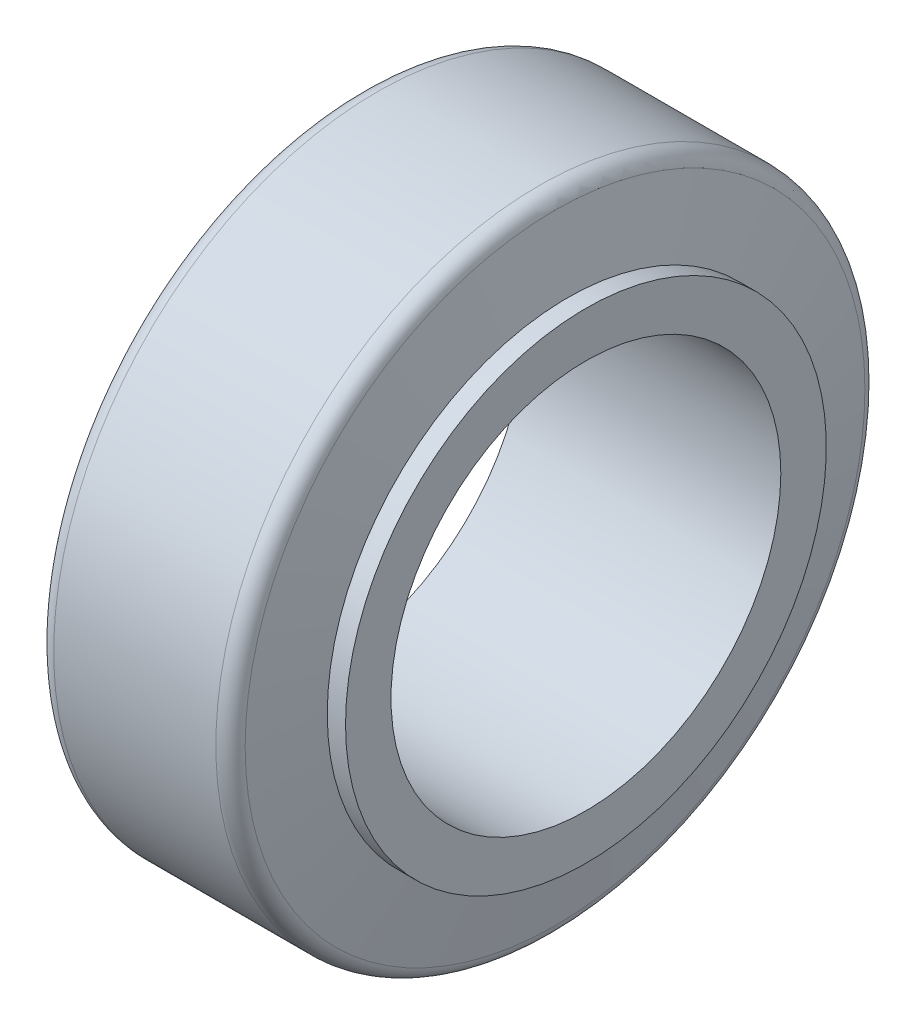
ISO-10303-21;
HEADER;
FILE_DESCRIPTION(('STEP AP214'),'2;1');
FILE_NAME('part.step','',(''),(''),'','','');
FILE_SCHEMA(('AUTOMOTIVE_DESIGN { 1 0 10303 214 1 1 1 1 }'));
ENDSEC;
DATA;
#1=APPLICATION_CONTEXT('core data for automotive mechanical design processes');
#2=APPLICATION_PROTOCOL_DEFINITION('international standard','automotive_design',2000,#1);
#3=PRODUCT_CONTEXT('',#1,'mechanical');
#4=PRODUCT('Part','Part','',(#3));
#5=PRODUCT_RELATED_PRODUCT_CATEGORY('part','',(#4));
#6=PRODUCT_DEFINITION_FORMATION('','',#4);
#7=PRODUCT_DEFINITION_CONTEXT('part definition',#1,'design');
#8=PRODUCT_DEFINITION('design','',#6,#7);
#9=PRODUCT_DEFINITION_SHAPE('','',#8);
#10=(LENGTH_UNIT() NAMED_UNIT(*) SI_UNIT(.MILLI.,.METRE.));
#11=(NAMED_UNIT(*) PLANE_ANGLE_UNIT() SI_UNIT($,.RADIAN.));
#12=(NAMED_UNIT(*) SI_UNIT($,.STERADIAN.) SOLID_ANGLE_UNIT());
#13=UNCERTAINTY_MEASURE_WITH_UNIT(LENGTH_MEASURE(1.E-05),#10,'distance_accuracy_value','');
#14=(GEOMETRIC_REPRESENTATION_CONTEXT(3) GLOBAL_UNCERTAINTY_ASSIGNED_CONTEXT((#13)) GLOBAL_UNIT_ASSIGNED_CONTEXT((#10,
#11,#12)) REPRESENTATION_CONTEXT('',''));
#15=CARTESIAN_POINT('',(0.,0.,0.));
#16=DIRECTION('',(0.,0.,1.));
#17=DIRECTION('',(1.,0.,0.));
#18=AXIS2_PLACEMENT_3D('',#15,#16,#17);
#19=CARTESIAN_POINT('',(11.65,0.,0.));
#20=DIRECTION('',(-1.,0.,0.));
#21=DIRECTION('',(0.,0.,1.));
#22=AXIS2_PLACEMENT_3D('',#19,#20,#21);
#23=CONICAL_SURFACE('',#22,39.8,1.39137423336047);
#24=CARTESIAN_POINT('',(11.9480092545903,0.,0.));
#25=DIRECTION('',(1.,0.,0.));
#26=DIRECTION('',(0.,0.,-1.));
#27=AXIS2_PLACEMENT_3D('',#24,#25,#26);
#28=CIRCLE('',#27,38.1569219476642);
#29=CARTESIAN_POINT('',(11.9480092545903,0.,-38.1569219476642));
#30=VERTEX_POINT('',#29);
#31=EDGE_CURVE('E10',#30,#30,#28,.T.);
#32=ORIENTED_EDGE('',*,*,#31,.T.);
#33=EDGE_LOOP('',(#32));
#34=FACE_BOUND('',#33,.T.);
#35=CARTESIAN_POINT('',(13.5,0.,0.));
#36=DIRECTION('',(-1.,0.,0.));
#37=DIRECTION('',(0.,0.,1.));
#38=AXIS2_PLACEMENT_3D('',#35,#36,#37);
#39=CIRCLE('',#38,29.6);
#40=CARTESIAN_POINT('',(13.5,0.,29.6));
#41=VERTEX_POINT('',#40);
#42=EDGE_CURVE('E58',#41,#41,#39,.T.);
#43=ORIENTED_EDGE('',*,*,#42,.T.);
#44=EDGE_LOOP('',(#43));
#45=FACE_BOUND('',#44,.T.);
#46=ADVANCED_FACE('F38',(#34,#45),#23,.T.);
#47=CARTESIAN_POINT('',(0.,0.,0.));
#48=DIRECTION('',(-1.,0.,0.));
#49=DIRECTION('',(0.,0.,1.));
#50=AXIS2_PLACEMENT_3D('',#47,#48,#49);
#51=CYLINDRICAL_SURFACE('',#50,29.6);
#52=CARTESIAN_POINT('',(15.75,0.,0.));
#53=DIRECTION('',(-1.,0.,0.));
#54=DIRECTION('',(0.,0.,1.));
#55=AXIS2_PLACEMENT_3D('',#52,#53,#54);
#56=CIRCLE('',#55,29.6);
#57=CARTESIAN_POINT('',(15.75,0.,29.6));
#58=VERTEX_POINT('',#57);
#59=EDGE_CURVE('E61',#58,#58,#56,.T.);
#60=ORIENTED_EDGE('',*,*,#59,.T.);
#61=EDGE_LOOP('',(#60));
#62=FACE_BOUND('',#61,.T.);
#63=ORIENTED_EDGE('',*,*,#42,.F.);
#64=EDGE_LOOP('',(#63));
#65=FACE_BOUND('',#64,.T.);
#66=ADVANCED_FACE('F98',(#62,#65),#51,.T.);
#67=CARTESIAN_POINT('',(15.75,-29.6,0.));
#68=DIRECTION('',(1.,0.,0.));
#69=DIRECTION('',(0.,0.,-1.));
#70=AXIS2_PLACEMENT_3D('',#67,#68,#69);
#71=PLANE('',#70);
#72=CARTESIAN_POINT('',(15.75,0.,0.));
#73=DIRECTION('',(1.,0.,0.));
#74=DIRECTION('',(0.,0.,-1.));
#75=AXIS2_PLACEMENT_3D('',#72,#73,#74);
#76=CIRCLE('',#75,24.);
#77=CARTESIAN_POINT('',(15.75,0.,-24.));
#78=VERTEX_POINT('',#77);
#79=EDGE_CURVE('E70',#78,#78,#76,.T.);
#80=ORIENTED_EDGE('',*,*,#79,.F.);
#81=EDGE_LOOP('',(#80));
#82=FACE_BOUND('',#81,.T.);
#83=ORIENTED_EDGE('',*,*,#59,.F.);
#84=EDGE_LOOP('',(#83));
#85=FACE_BOUND('',#84,.T.);
#86=ADVANCED_FACE('F83',(#82,#85),#71,.T.);
#87=CARTESIAN_POINT('',(-15.75,-29.6,0.));
#88=DIRECTION('',(-1.,0.,0.));
#89=DIRECTION('',(0.,0.,1.));
#90=AXIS2_PLACEMENT_3D('',#87,#88,#89);
#91=PLANE('',#90);
#92=CARTESIAN_POINT('',(-15.75,0.,0.));
#93=DIRECTION('',(-1.,0.,0.));
#94=DIRECTION('',(0.,0.,1.));
#95=AXIS2_PLACEMENT_3D('',#92,#93,#94);
#96=CIRCLE('',#95,24.);
#97=CARTESIAN_POINT('',(-15.75,0.,24.));
#98=VERTEX_POINT('',#97);
#99=EDGE_CURVE('E42',#98,#98,#96,.T.);
#100=ORIENTED_EDGE('',*,*,#99,.F.);
#101=EDGE_LOOP('',(#100));
#102=FACE_BOUND('',#101,.T.);
#103=CARTESIAN_POINT('',(-15.75,0.,0.));
#104=DIRECTION('',(-1.,0.,0.));
#105=DIRECTION('',(0.,0.,1.));
#106=AXIS2_PLACEMENT_3D('',#103,#104,#105);
#107=CIRCLE('',#106,29.6);
#108=CARTESIAN_POINT('',(-15.75,0.,29.6));
#109=VERTEX_POINT('',#108);
#110=EDGE_CURVE('E64',#109,#109,#107,.T.);
#111=ORIENTED_EDGE('',*,*,#110,.T.);
#112=EDGE_LOOP('',(#111));
#113=FACE_BOUND('',#112,.T.);
#114=ADVANCED_FACE('F79',(#102,#113),#91,.T.);
#115=CARTESIAN_POINT('',(0.,0.,0.));
#116=DIRECTION('',(-1.,0.,0.));
#117=DIRECTION('',(0.,0.,1.));
#118=AXIS2_PLACEMENT_3D('',#115,#116,#117);
#119=CYLINDRICAL_SURFACE('',#118,29.6);
#120=CARTESIAN_POINT('',(-13.5,0.,0.));
#121=DIRECTION('',(-1.,0.,0.));
#122=DIRECTION('',(0.,0.,1.));
#123=AXIS2_PLACEMENT_3D('',#120,#121,#122);
#124=CIRCLE('',#123,29.6);
#125=CARTESIAN_POINT('',(-13.5,0.,29.6));
#126=VERTEX_POINT('',#125);
#127=EDGE_CURVE('E67',#126,#126,#124,.T.);
#128=ORIENTED_EDGE('',*,*,#127,.T.);
#129=EDGE_LOOP('',(#128));
#130=FACE_BOUND('',#129,.T.);
#131=ORIENTED_EDGE('',*,*,#110,.F.);
#132=EDGE_LOOP('',(#131));
#133=FACE_BOUND('',#132,.T.);
#134=ADVANCED_FACE('F82',(#130,#133),#119,.T.);
#135=CARTESIAN_POINT('',(-13.5,0.,0.));
#136=DIRECTION('',(1.,0.,0.));
#137=DIRECTION('',(0.,0.,-1.));
#138=AXIS2_PLACEMENT_3D('',#135,#136,#137);
#139=CONICAL_SURFACE('',#138,29.6,1.39137423336047);
#140=CARTESIAN_POINT('',(-11.9480092545903,0.,0.));
#141=DIRECTION('',(-1.,0.,0.));
#142=DIRECTION('',(0.,0.,1.));
#143=AXIS2_PLACEMENT_3D('',#140,#141,#142);
#144=CIRCLE('',#143,38.1569219476642);
#145=CARTESIAN_POINT('',(-11.9480092545903,0.,38.1569219476642));
#146=VERTEX_POINT('',#145);
#147=EDGE_CURVE('E55',#146,#146,#144,.T.);
#148=ORIENTED_EDGE('',*,*,#147,.T.);
#149=EDGE_LOOP('',(#148));
#150=FACE_BOUND('',#149,.T.);
#151=ORIENTED_EDGE('',*,*,#127,.F.);
#152=EDGE_LOOP('',(#151));
#153=FACE_BOUND('',#152,.T.);
#154=ADVANCED_FACE('F88',(#150,#153),#139,.T.);
#155=CARTESIAN_POINT('',(0.,0.,0.));
#156=DIRECTION('',(-1.,0.,0.));
#157=DIRECTION('',(0.,0.,1.));
#158=AXIS2_PLACEMENT_3D('',#155,#156,#157);
#159=CYLINDRICAL_SURFACE('',#158,39.8);
#160=CARTESIAN_POINT('',(-9.98011527287392,0.,0.));
#161=DIRECTION('',(1.,0.,0.));
#162=DIRECTION('',(0.,0.,-1.));
#163=AXIS2_PLACEMENT_3D('',#160,#161,#162);
#164=CIRCLE('',#163,39.8);
#165=CARTESIAN_POINT('',(-9.98011527287392,0.,-39.8));
#166=VERTEX_POINT('',#165);
#167=EDGE_CURVE('E46',#166,#166,#164,.T.);
#168=ORIENTED_EDGE('',*,*,#167,.T.);
#169=EDGE_LOOP('',(#168));
#170=FACE_BOUND('',#169,.T.);
#171=CARTESIAN_POINT('',(9.98011527287393,0.,0.));
#172=DIRECTION('',(1.,0.,0.));
#173=DIRECTION('',(0.,0.,-1.));
#174=AXIS2_PLACEMENT_3D('',#171,#172,#173);
#175=CIRCLE('',#174,39.8);
#176=CARTESIAN_POINT('',(9.98011527287393,0.,-39.8));
#177=VERTEX_POINT('',#176);
#178=EDGE_CURVE('E50',#177,#177,#175,.F.);
#179=ORIENTED_EDGE('',*,*,#178,.T.);
#180=EDGE_LOOP('',(#179));
#181=FACE_BOUND('',#180,.T.);
#182=ADVANCED_FACE('F94',(#170,#181),#159,.T.);
#183=CARTESIAN_POINT('',(-9.98011527287392,0.,0.));
#184=DIRECTION('',(1.,0.,0.));
#185=DIRECTION('',(0.,0.,-1.));
#186=AXIS2_PLACEMENT_3D('',#183,#184,#185);
#187=TOROIDAL_SURFACE('',#186,37.8,2.);
#188=ORIENTED_EDGE('',*,*,#167,.F.);
#189=EDGE_LOOP('',(#188));
#190=FACE_BOUND('',#189,.T.);
#191=ORIENTED_EDGE('',*,*,#147,.F.);
#192=EDGE_LOOP('',(#191));
#193=FACE_BOUND('',#192,.T.);
#194=ADVANCED_FACE('F107',(#190,#193),#187,.T.);
#195=CARTESIAN_POINT('',(9.98011527287393,0.,0.));
#196=DIRECTION('',(1.,0.,0.));
#197=DIRECTION('',(0.,0.,-1.));
#198=AXIS2_PLACEMENT_3D('',#195,#196,#197);
#199=TOROIDAL_SURFACE('',#198,37.8,2.);
#200=ORIENTED_EDGE('',*,*,#31,.F.);
#201=EDGE_LOOP('',(#200));
#202=FACE_BOUND('',#201,.T.);
#203=ORIENTED_EDGE('',*,*,#178,.F.);
#204=EDGE_LOOP('',(#203));
#205=FACE_BOUND('',#204,.T.);
#206=ADVANCED_FACE('F40',(#202,#205),#199,.T.);
#207=CARTESIAN_POINT('',(-20.15,0.,0.));
#208=DIRECTION('',(1.,0.,0.));
#209=DIRECTION('',(0.,0.,-1.));
#210=AXIS2_PLACEMENT_3D('',#207,#208,#209);
#211=CYLINDRICAL_SURFACE('',#210,24.);
#212=ORIENTED_EDGE('',*,*,#79,.T.);
#213=EDGE_LOOP('',(#212));
#214=FACE_BOUND('',#213,.T.);
#215=ORIENTED_EDGE('',*,*,#99,.T.);
#216=EDGE_LOOP('',(#215));
#217=FACE_BOUND('',#216,.T.);
#218=ADVANCED_FACE('F77',(#214,#217),#211,.F.);
#219=CLOSED_SHELL('',(#46,#66,#86,#114,#134,#154,#182,#194,#206,#218));
#220=MANIFOLD_SOLID_BREP('B2',#219);
#221=ADVANCED_BREP_SHAPE_REPRESENTATION('',(#18,#220),#14);
#222=SHAPE_DEFINITION_REPRESENTATION(#9,#221);
ENDSEC;
END-ISO-10303-21;
